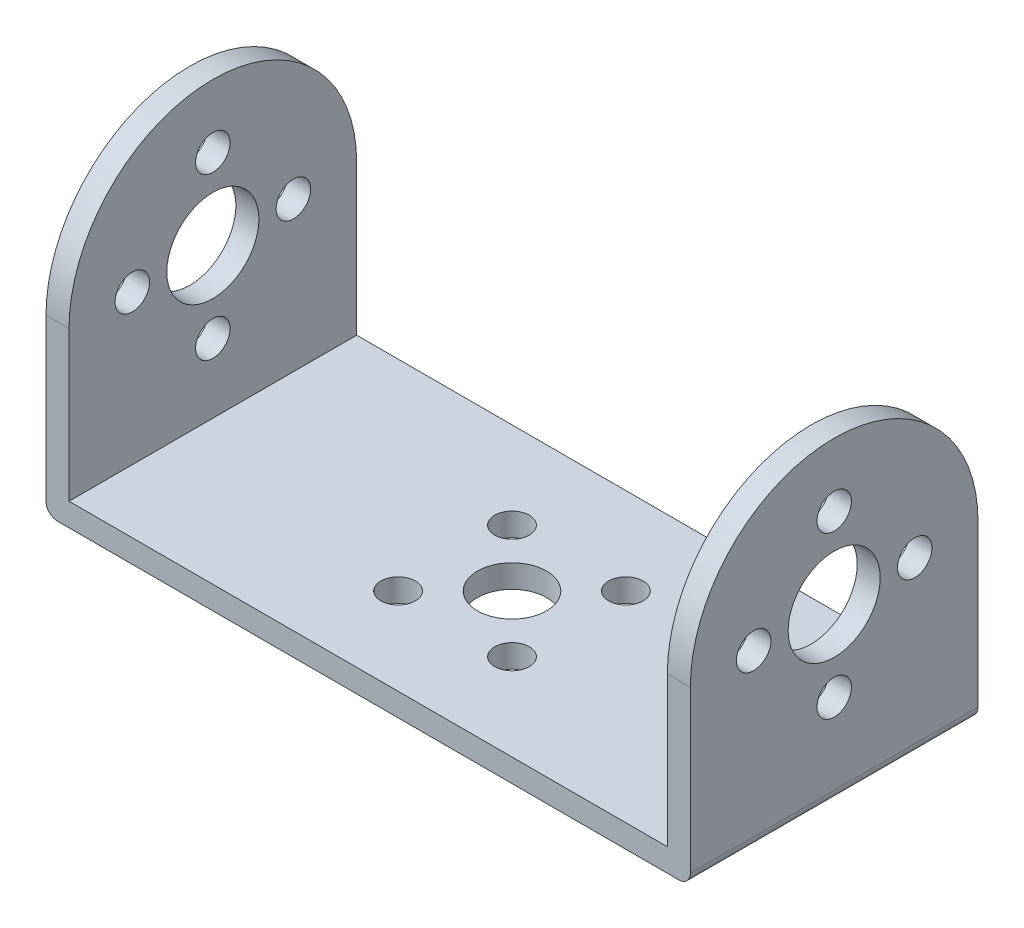
ISO-10303-21;
HEADER;
FILE_DESCRIPTION(('STEP AP214'),'2;1');
FILE_NAME('part.step','',(''),(''),'','','');
FILE_SCHEMA(('AUTOMOTIVE_DESIGN { 1 0 10303 214 1 1 1 1 }'));
ENDSEC;
DATA;
#1=APPLICATION_CONTEXT('core data for automotive mechanical design processes');
#2=APPLICATION_PROTOCOL_DEFINITION('international standard','automotive_design',2000,#1);
#3=PRODUCT_CONTEXT('',#1,'mechanical');
#4=PRODUCT('Part','Part','',(#3));
#5=PRODUCT_RELATED_PRODUCT_CATEGORY('part','',(#4));
#6=PRODUCT_DEFINITION_FORMATION('','',#4);
#7=PRODUCT_DEFINITION_CONTEXT('part definition',#1,'design');
#8=PRODUCT_DEFINITION('design','',#6,#7);
#9=PRODUCT_DEFINITION_SHAPE('','',#8);
#10=(LENGTH_UNIT() NAMED_UNIT(*) SI_UNIT(.MILLI.,.METRE.));
#11=(NAMED_UNIT(*) PLANE_ANGLE_UNIT() SI_UNIT($,.RADIAN.));
#12=(NAMED_UNIT(*) SI_UNIT($,.STERADIAN.) SOLID_ANGLE_UNIT());
#13=UNCERTAINTY_MEASURE_WITH_UNIT(LENGTH_MEASURE(1.E-05),#10,'distance_accuracy_value','');
#14=(GEOMETRIC_REPRESENTATION_CONTEXT(3) GLOBAL_UNCERTAINTY_ASSIGNED_CONTEXT((#13)) GLOBAL_UNIT_ASSIGNED_CONTEXT((#10,
#11,#12)) REPRESENTATION_CONTEXT('',''));
#15=CARTESIAN_POINT('',(0.,0.,0.));
#16=DIRECTION('',(0.,0.,1.));
#17=DIRECTION('',(1.,0.,0.));
#18=AXIS2_PLACEMENT_3D('',#15,#16,#17);
#19=CARTESIAN_POINT('',(0.,2.,0.));
#20=DIRECTION('',(0.,1.,0.));
#21=DIRECTION('',(0.,0.,1.));
#22=AXIS2_PLACEMENT_3D('',#19,#20,#21);
#23=PLANE('',#22);
#24=CARTESIAN_POINT('',(12.6040027874548,2.,-5.68113044702918));
#25=DIRECTION('',(0.,1.,0.));
#26=DIRECTION('',(0.,0.,1.));
#27=AXIS2_PLACEMENT_3D('',#24,#25,#26);
#28=CIRCLE('',#27,1.5);
#29=CARTESIAN_POINT('',(12.6040027874548,2.,-4.18113044702918));
#30=VERTEX_POINT('',#29);
#31=EDGE_CURVE('E240',#30,#30,#28,.T.);
#32=ORIENTED_EDGE('',*,*,#31,.F.);
#33=EDGE_LOOP('',(#32));
#34=FACE_BOUND('',#33,.T.);
#35=CARTESIAN_POINT('',(2.70450785084305,2.,-5.68113044702918));
#36=DIRECTION('',(0.,1.,0.));
#37=DIRECTION('',(0.,0.,1.));
#38=AXIS2_PLACEMENT_3D('',#35,#36,#37);
#39=CIRCLE('',#38,1.5);
#40=CARTESIAN_POINT('',(2.70450785084305,2.,-4.18113044702918));
#41=VERTEX_POINT('',#40);
#42=EDGE_CURVE('E248',#41,#41,#39,.T.);
#43=ORIENTED_EDGE('',*,*,#42,.F.);
#44=EDGE_LOOP('',(#43));
#45=FACE_BOUND('',#44,.T.);
#46=CARTESIAN_POINT('',(12.6040027874548,2.,4.21836448958237));
#47=DIRECTION('',(0.,1.,0.));
#48=DIRECTION('',(0.,0.,1.));
#49=AXIS2_PLACEMENT_3D('',#46,#47,#48);
#50=CIRCLE('',#49,1.5);
#51=CARTESIAN_POINT('',(12.6040027874548,2.,5.71836448958237));
#52=VERTEX_POINT('',#51);
#53=EDGE_CURVE('E256',#52,#52,#50,.T.);
#54=ORIENTED_EDGE('',*,*,#53,.F.);
#55=EDGE_LOOP('',(#54));
#56=FACE_BOUND('',#55,.T.);
#57=CARTESIAN_POINT('',(2.70450785084305,2.,4.21836448958237));
#58=DIRECTION('',(0.,1.,0.));
#59=DIRECTION('',(0.,0.,1.));
#60=AXIS2_PLACEMENT_3D('',#57,#58,#59);
#61=CIRCLE('',#60,1.5);
#62=CARTESIAN_POINT('',(2.70450785084305,2.,5.71836448958237));
#63=VERTEX_POINT('',#62);
#64=EDGE_CURVE('E231',#63,#63,#61,.T.);
#65=ORIENTED_EDGE('',*,*,#64,.F.);
#66=EDGE_LOOP('',(#65));
#67=FACE_BOUND('',#66,.T.);
#68=CARTESIAN_POINT('',(7.65425531914894,2.,-0.731382978723405));
#69=DIRECTION('',(0.,1.,0.));
#70=DIRECTION('',(0.,0.,1.));
#71=AXIS2_PLACEMENT_3D('',#68,#69,#70);
#72=CIRCLE('',#71,3.);
#73=CARTESIAN_POINT('',(7.65425531914894,2.,2.2686170212766));
#74=VERTEX_POINT('',#73);
#75=EDGE_CURVE('E239',#74,#74,#72,.T.);
#76=ORIENTED_EDGE('',*,*,#75,.F.);
#77=EDGE_LOOP('',(#76));
#78=FACE_BOUND('',#77,.T.);
#79=DIRECTION('',(1.,0.,0.));
#80=VECTOR('',#79,1.);
#81=CARTESIAN_POINT('',(-20.3457446808511,2.,11.7686170212766));
#82=LINE('',#81,#80);
#83=CARTESIAN_POINT('',(-18.3457446808511,2.,11.7686170212766));
#84=VERTEX_POINT('',#83);
#85=CARTESIAN_POINT('',(33.6542553191489,2.,11.7686170212766));
#86=VERTEX_POINT('',#85);
#87=EDGE_CURVE('E275',#84,#86,#82,.T.);
#88=ORIENTED_EDGE('',*,*,#87,.T.);
#89=DIRECTION('',(0.,0.,1.));
#90=VECTOR('',#89,1.);
#91=CARTESIAN_POINT('',(33.6542553191489,2.,-13.2313829787234));
#92=LINE('',#91,#90);
#93=CARTESIAN_POINT('',(33.6542553191489,2.,-13.2313829787234));
#94=VERTEX_POINT('',#93);
#95=EDGE_CURVE('E131',#94,#86,#92,.T.);
#96=ORIENTED_EDGE('',*,*,#95,.F.);
#97=DIRECTION('',(-1.,0.,0.));
#98=VECTOR('',#97,1.);
#99=CARTESIAN_POINT('',(-20.3457446808511,2.,-13.2313829787234));
#100=LINE('',#99,#98);
#101=CARTESIAN_POINT('',(-18.3457446808511,2.,-13.2313829787234));
#102=VERTEX_POINT('',#101);
#103=EDGE_CURVE('E278',#94,#102,#100,.T.);
#104=ORIENTED_EDGE('',*,*,#103,.T.);
#105=DIRECTION('',(0.,0.,1.));
#106=VECTOR('',#105,1.);
#107=CARTESIAN_POINT('',(-18.3457446808511,2.,-13.2313829787234));
#108=LINE('',#107,#106);
#109=EDGE_CURVE('E215',#102,#84,#108,.T.);
#110=ORIENTED_EDGE('',*,*,#109,.T.);
#111=EDGE_LOOP('',(#88,#96,#104,#110));
#112=FACE_BOUND('',#111,.T.);
#113=ADVANCED_FACE('F42',(#34,#45,#56,#67,#78,#112),#23,.T.);
#114=CARTESIAN_POINT('',(-20.3457446808511,2.,-13.2313829787234));
#115=DIRECTION('',(1.,0.,0.));
#116=DIRECTION('',(0.,0.,-1.));
#117=AXIS2_PLACEMENT_3D('',#114,#115,#116);
#118=PLANE('',#117);
#119=CARTESIAN_POINT('',(-20.3457446808511,15.,-7.73138297872341));
#120=DIRECTION('',(-1.,0.,0.));
#121=DIRECTION('',(0.,0.,1.));
#122=AXIS2_PLACEMENT_3D('',#119,#120,#121);
#123=CIRCLE('',#122,1.5);
#124=CARTESIAN_POINT('',(-20.3457446808511,15.,-6.23138297872341));
#125=VERTEX_POINT('',#124);
#126=EDGE_CURVE('E165',#125,#125,#123,.T.);
#127=ORIENTED_EDGE('',*,*,#126,.F.);
#128=EDGE_LOOP('',(#127));
#129=FACE_BOUND('',#128,.T.);
#130=CARTESIAN_POINT('',(-20.3457446808511,8.,-0.731382978723406));
#131=DIRECTION('',(-1.,0.,0.));
#132=DIRECTION('',(0.,0.,1.));
#133=AXIS2_PLACEMENT_3D('',#130,#131,#132);
#134=CIRCLE('',#133,1.5);
#135=CARTESIAN_POINT('',(-20.3457446808511,8.,0.768617021276592));
#136=VERTEX_POINT('',#135);
#137=EDGE_CURVE('E167',#136,#136,#134,.T.);
#138=ORIENTED_EDGE('',*,*,#137,.F.);
#139=EDGE_LOOP('',(#138));
#140=FACE_BOUND('',#139,.T.);
#141=CARTESIAN_POINT('',(-20.3457446808511,15.,6.2686170212766));
#142=DIRECTION('',(-1.,0.,0.));
#143=DIRECTION('',(0.,0.,1.));
#144=AXIS2_PLACEMENT_3D('',#141,#142,#143);
#145=CIRCLE('',#144,1.5);
#146=CARTESIAN_POINT('',(-20.3457446808511,15.,7.7686170212766));
#147=VERTEX_POINT('',#146);
#148=EDGE_CURVE('E176',#147,#147,#145,.T.);
#149=ORIENTED_EDGE('',*,*,#148,.F.);
#150=EDGE_LOOP('',(#149));
#151=FACE_BOUND('',#150,.T.);
#152=CARTESIAN_POINT('',(-20.3457446808511,22.,-0.731382978723407));
#153=DIRECTION('',(-1.,0.,0.));
#154=DIRECTION('',(0.,0.,1.));
#155=AXIS2_PLACEMENT_3D('',#152,#153,#154);
#156=CIRCLE('',#155,1.5);
#157=CARTESIAN_POINT('',(-20.3457446808511,22.,0.768617021276595));
#158=VERTEX_POINT('',#157);
#159=EDGE_CURVE('E183',#158,#158,#156,.T.);
#160=ORIENTED_EDGE('',*,*,#159,.F.);
#161=EDGE_LOOP('',(#160));
#162=FACE_BOUND('',#161,.T.);
#163=CARTESIAN_POINT('',(-20.3457446808511,15.,-0.731382978723407));
#164=DIRECTION('',(-1.,0.,0.));
#165=DIRECTION('',(0.,0.,1.));
#166=AXIS2_PLACEMENT_3D('',#163,#164,#165);
#167=CIRCLE('',#166,4.);
#168=CARTESIAN_POINT('',(-20.3457446808511,15.,3.2686170212766));
#169=VERTEX_POINT('',#168);
#170=EDGE_CURVE('E192',#169,#169,#167,.T.);
#171=ORIENTED_EDGE('',*,*,#170,.F.);
#172=EDGE_LOOP('',(#171));
#173=FACE_BOUND('',#172,.T.);
#174=DIRECTION('',(0.,-1.,0.));
#175=VECTOR('',#174,1.);
#176=CARTESIAN_POINT('',(-20.3457446808511,2.,-13.2313829787234));
#177=LINE('',#176,#175);
#178=CARTESIAN_POINT('',(-20.3457446808511,15.,-13.2313829787234));
#179=VERTEX_POINT('',#178);
#180=CARTESIAN_POINT('',(-20.3457446808511,1.,-13.2313829787234));
#181=VERTEX_POINT('',#180);
#182=EDGE_CURVE('E282',#179,#181,#177,.T.);
#183=ORIENTED_EDGE('',*,*,#182,.T.);
#184=DIRECTION('',(0.,0.,1.));
#185=VECTOR('',#184,1.);
#186=CARTESIAN_POINT('',(-20.3457446808511,1.,-13.2313829787234));
#187=LINE('',#186,#185);
#188=CARTESIAN_POINT('',(-20.3457446808511,1.,11.7686170212766));
#189=VERTEX_POINT('',#188);
#190=EDGE_CURVE('E11',#181,#189,#187,.T.);
#191=ORIENTED_EDGE('',*,*,#190,.T.);
#192=DIRECTION('',(0.,-1.,0.));
#193=VECTOR('',#192,1.);
#194=CARTESIAN_POINT('',(-20.3457446808511,2.,11.7686170212766));
#195=LINE('',#194,#193);
#196=CARTESIAN_POINT('',(-20.3457446808511,15.,11.7686170212766));
#197=VERTEX_POINT('',#196);
#198=EDGE_CURVE('E297',#197,#189,#195,.T.);
#199=ORIENTED_EDGE('',*,*,#198,.F.);
#200=CARTESIAN_POINT('',(-20.3457446808511,15.,-0.731382978723407));
#201=DIRECTION('',(-1.,0.,0.));
#202=DIRECTION('',(0.,0.,1.));
#203=AXIS2_PLACEMENT_3D('',#200,#201,#202);
#204=CIRCLE('',#203,12.5);
#205=EDGE_CURVE('E206',#197,#179,#204,.T.);
#206=ORIENTED_EDGE('',*,*,#205,.T.);
#207=EDGE_LOOP('',(#183,#191,#199,#206));
#208=FACE_BOUND('',#207,.T.);
#209=ADVANCED_FACE('F329',(#129,#140,#151,#162,#173,#208),#118,.F.);
#210=CARTESIAN_POINT('',(-20.3457446808511,2.,11.7686170212766));
#211=DIRECTION('',(0.,0.,-1.));
#212=DIRECTION('',(-1.,0.,0.));
#213=AXIS2_PLACEMENT_3D('',#210,#211,#212);
#214=PLANE('',#213);
#215=DIRECTION('',(1.,0.,0.));
#216=VECTOR('',#215,1.);
#217=CARTESIAN_POINT('',(-20.3457446808511,0.,11.7686170212766));
#218=LINE('',#217,#216);
#219=CARTESIAN_POINT('',(-19.3457446808511,0.,11.7686170212766));
#220=VERTEX_POINT('',#219);
#221=CARTESIAN_POINT('',(34.6542553191489,0.,11.7686170212766));
#222=VERTEX_POINT('',#221);
#223=EDGE_CURVE('E271',#220,#222,#218,.T.);
#224=ORIENTED_EDGE('',*,*,#223,.T.);
#225=CARTESIAN_POINT('',(34.6542553191489,1.,11.7686170212766));
#226=DIRECTION('',(0.,0.,-1.));
#227=DIRECTION('',(-1.,0.,0.));
#228=AXIS2_PLACEMENT_3D('',#225,#226,#227);
#229=CIRCLE('',#228,1.);
#230=CARTESIAN_POINT('',(35.6542553191489,1.,11.7686170212766));
#231=VERTEX_POINT('',#230);
#232=EDGE_CURVE('E51',#222,#231,#229,.F.);
#233=ORIENTED_EDGE('',*,*,#232,.T.);
#234=DIRECTION('',(0.,-1.,0.));
#235=VECTOR('',#234,1.);
#236=CARTESIAN_POINT('',(35.6542553191489,2.,11.7686170212766));
#237=LINE('',#236,#235);
#238=CARTESIAN_POINT('',(35.6542553191489,15.,11.7686170212766));
#239=VERTEX_POINT('',#238);
#240=EDGE_CURVE('E140',#239,#231,#237,.T.);
#241=ORIENTED_EDGE('',*,*,#240,.F.);
#242=DIRECTION('',(1.,0.,0.));
#243=VECTOR('',#242,1.);
#244=CARTESIAN_POINT('',(33.6542553191489,15.,11.7686170212766));
#245=LINE('',#244,#243);
#246=CARTESIAN_POINT('',(33.6542553191489,15.,11.7686170212766));
#247=VERTEX_POINT('',#246);
#248=EDGE_CURVE('E137',#247,#239,#245,.T.);
#249=ORIENTED_EDGE('',*,*,#248,.F.);
#250=DIRECTION('',(0.,1.,0.));
#251=VECTOR('',#250,1.);
#252=CARTESIAN_POINT('',(33.6542553191489,15.,11.7686170212766));
#253=LINE('',#252,#251);
#254=EDGE_CURVE('E123',#86,#247,#253,.T.);
#255=ORIENTED_EDGE('',*,*,#254,.F.);
#256=ORIENTED_EDGE('',*,*,#87,.F.);
#257=DIRECTION('',(0.,1.,0.));
#258=VECTOR('',#257,1.);
#259=CARTESIAN_POINT('',(-18.3457446808511,15.,11.7686170212766));
#260=LINE('',#259,#258);
#261=CARTESIAN_POINT('',(-18.3457446808511,15.,11.7686170212766));
#262=VERTEX_POINT('',#261);
#263=EDGE_CURVE('E219',#84,#262,#260,.T.);
#264=ORIENTED_EDGE('',*,*,#263,.T.);
#265=DIRECTION('',(-1.,0.,0.));
#266=VECTOR('',#265,1.);
#267=CARTESIAN_POINT('',(-18.3457446808511,15.,11.7686170212766));
#268=LINE('',#267,#266);
#269=EDGE_CURVE('E227',#262,#197,#268,.T.);
#270=ORIENTED_EDGE('',*,*,#269,.T.);
#271=ORIENTED_EDGE('',*,*,#198,.T.);
#272=CARTESIAN_POINT('',(-19.3457446808511,1.,11.7686170212766));
#273=DIRECTION('',(0.,0.,-1.));
#274=DIRECTION('',(-1.,0.,0.));
#275=AXIS2_PLACEMENT_3D('',#272,#273,#274);
#276=CIRCLE('',#275,1.);
#277=EDGE_CURVE('E58',#189,#220,#276,.F.);
#278=ORIENTED_EDGE('',*,*,#277,.T.);
#279=EDGE_LOOP('',(#224,#233,#241,#249,#255,#256,#264,#270,#271,#278));
#280=FACE_BOUND('',#279,.T.);
#281=ADVANCED_FACE('F138',(#280),#214,.F.);
#282=CARTESIAN_POINT('',(35.6542553191489,2.,-13.2313829787234));
#283=DIRECTION('',(-1.,0.,0.));
#284=DIRECTION('',(0.,0.,1.));
#285=AXIS2_PLACEMENT_3D('',#282,#283,#284);
#286=PLANE('',#285);
#287=CARTESIAN_POINT('',(35.6542553191489,15.,-7.73138297872341));
#288=DIRECTION('',(-1.,0.,0.));
#289=DIRECTION('',(0.,0.,1.));
#290=AXIS2_PLACEMENT_3D('',#287,#288,#289);
#291=CIRCLE('',#290,1.5);
#292=CARTESIAN_POINT('',(35.6542553191489,15.,-6.23138297872341));
#293=VERTEX_POINT('',#292);
#294=EDGE_CURVE('E740',#293,#293,#291,.T.);
#295=ORIENTED_EDGE('',*,*,#294,.T.);
#296=EDGE_LOOP('',(#295));
#297=FACE_BOUND('',#296,.T.);
#298=CARTESIAN_POINT('',(35.6542553191489,8.,-0.731382978723406));
#299=DIRECTION('',(-1.,0.,0.));
#300=DIRECTION('',(0.,0.,1.));
#301=AXIS2_PLACEMENT_3D('',#298,#299,#300);
#302=CIRCLE('',#301,1.5);
#303=CARTESIAN_POINT('',(35.6542553191489,8.,0.768617021276592));
#304=VERTEX_POINT('',#303);
#305=EDGE_CURVE('E733',#304,#304,#302,.T.);
#306=ORIENTED_EDGE('',*,*,#305,.T.);
#307=EDGE_LOOP('',(#306));
#308=FACE_BOUND('',#307,.T.);
#309=CARTESIAN_POINT('',(35.6542553191489,15.,6.2686170212766));
#310=DIRECTION('',(-1.,0.,0.));
#311=DIRECTION('',(0.,0.,1.));
#312=AXIS2_PLACEMENT_3D('',#309,#310,#311);
#313=CIRCLE('',#312,1.5);
#314=CARTESIAN_POINT('',(35.6542553191489,15.,7.7686170212766));
#315=VERTEX_POINT('',#314);
#316=EDGE_CURVE('E724',#315,#315,#313,.T.);
#317=ORIENTED_EDGE('',*,*,#316,.T.);
#318=EDGE_LOOP('',(#317));
#319=FACE_BOUND('',#318,.T.);
#320=CARTESIAN_POINT('',(35.6542553191489,22.,-0.731382978723407));
#321=DIRECTION('',(-1.,0.,0.));
#322=DIRECTION('',(0.,0.,1.));
#323=AXIS2_PLACEMENT_3D('',#320,#321,#322);
#324=CIRCLE('',#323,1.5);
#325=CARTESIAN_POINT('',(35.6542553191489,22.,0.768617021276595));
#326=VERTEX_POINT('',#325);
#327=EDGE_CURVE('E715',#326,#326,#324,.T.);
#328=ORIENTED_EDGE('',*,*,#327,.T.);
#329=EDGE_LOOP('',(#328));
#330=FACE_BOUND('',#329,.T.);
#331=CARTESIAN_POINT('',(35.6542553191489,15.,-0.731382978723407));
#332=DIRECTION('',(-1.,0.,0.));
#333=DIRECTION('',(0.,0.,1.));
#334=AXIS2_PLACEMENT_3D('',#331,#332,#333);
#335=CIRCLE('',#334,4.);
#336=CARTESIAN_POINT('',(35.6542553191489,15.,3.2686170212766));
#337=VERTEX_POINT('',#336);
#338=EDGE_CURVE('E154',#337,#337,#335,.T.);
#339=ORIENTED_EDGE('',*,*,#338,.T.);
#340=EDGE_LOOP('',(#339));
#341=FACE_BOUND('',#340,.T.);
#342=ORIENTED_EDGE('',*,*,#240,.T.);
#343=DIRECTION('',(0.,0.,-1.));
#344=VECTOR('',#343,1.);
#345=CARTESIAN_POINT('',(35.6542553191489,1.,-13.2313829787234));
#346=LINE('',#345,#344);
#347=CARTESIAN_POINT('',(35.6542553191489,1.,-13.2313829787234));
#348=VERTEX_POINT('',#347);
#349=EDGE_CURVE('E301',#231,#348,#346,.T.);
#350=ORIENTED_EDGE('',*,*,#349,.T.);
#351=DIRECTION('',(0.,-1.,0.));
#352=VECTOR('',#351,1.);
#353=CARTESIAN_POINT('',(35.6542553191489,2.,-13.2313829787234));
#354=LINE('',#353,#352);
#355=CARTESIAN_POINT('',(35.6542553191489,15.,-13.2313829787234));
#356=VERTEX_POINT('',#355);
#357=EDGE_CURVE('E291',#356,#348,#354,.T.);
#358=ORIENTED_EDGE('',*,*,#357,.F.);
#359=CARTESIAN_POINT('',(35.6542553191489,15.,-0.731382978723407));
#360=DIRECTION('',(-1.,0.,0.));
#361=DIRECTION('',(0.,0.,1.));
#362=AXIS2_PLACEMENT_3D('',#359,#360,#361);
#363=CIRCLE('',#362,12.5);
#364=EDGE_CURVE('E151',#239,#356,#363,.T.);
#365=ORIENTED_EDGE('',*,*,#364,.F.);
#366=EDGE_LOOP('',(#342,#350,#358,#365));
#367=FACE_BOUND('',#366,.T.);
#368=ADVANCED_FACE('F322',(#297,#308,#319,#330,#341,#367),#286,.F.);
#369=CARTESIAN_POINT('',(-20.3457446808511,2.,-13.2313829787234));
#370=DIRECTION('',(0.,0.,1.));
#371=DIRECTION('',(1.,0.,0.));
#372=AXIS2_PLACEMENT_3D('',#369,#370,#371);
#373=PLANE('',#372);
#374=ORIENTED_EDGE('',*,*,#357,.T.);
#375=CARTESIAN_POINT('',(34.6542553191489,1.,-13.2313829787234));
#376=DIRECTION('',(0.,0.,1.));
#377=DIRECTION('',(1.,0.,0.));
#378=AXIS2_PLACEMENT_3D('',#375,#376,#377);
#379=CIRCLE('',#378,1.);
#380=CARTESIAN_POINT('',(34.6542553191489,0.,-13.2313829787234));
#381=VERTEX_POINT('',#380);
#382=EDGE_CURVE('E308',#348,#381,#379,.F.);
#383=ORIENTED_EDGE('',*,*,#382,.T.);
#384=DIRECTION('',(-1.,0.,0.));
#385=VECTOR('',#384,1.);
#386=CARTESIAN_POINT('',(-20.3457446808511,0.,-13.2313829787234));
#387=LINE('',#386,#385);
#388=CARTESIAN_POINT('',(-19.3457446808511,0.,-13.2313829787234));
#389=VERTEX_POINT('',#388);
#390=EDGE_CURVE('E279',#381,#389,#387,.T.);
#391=ORIENTED_EDGE('',*,*,#390,.T.);
#392=CARTESIAN_POINT('',(-19.3457446808511,1.,-13.2313829787234));
#393=DIRECTION('',(0.,0.,1.));
#394=DIRECTION('',(1.,0.,0.));
#395=AXIS2_PLACEMENT_3D('',#392,#393,#394);
#396=CIRCLE('',#395,1.);
#397=EDGE_CURVE('E305',#389,#181,#396,.F.);
#398=ORIENTED_EDGE('',*,*,#397,.T.);
#399=ORIENTED_EDGE('',*,*,#182,.F.);
#400=DIRECTION('',(-1.,0.,0.));
#401=VECTOR('',#400,1.);
#402=CARTESIAN_POINT('',(-18.3457446808511,15.,-13.2313829787234));
#403=LINE('',#402,#401);
#404=CARTESIAN_POINT('',(-18.3457446808511,15.,-13.2313829787234));
#405=VERTEX_POINT('',#404);
#406=EDGE_CURVE('E223',#405,#179,#403,.T.);
#407=ORIENTED_EDGE('',*,*,#406,.F.);
#408=DIRECTION('',(0.,-1.,0.));
#409=VECTOR('',#408,1.);
#410=CARTESIAN_POINT('',(-18.3457446808511,15.,-13.2313829787234));
#411=LINE('',#410,#409);
#412=EDGE_CURVE('E211',#405,#102,#411,.T.);
#413=ORIENTED_EDGE('',*,*,#412,.T.);
#414=ORIENTED_EDGE('',*,*,#103,.F.);
#415=DIRECTION('',(0.,-1.,0.));
#416=VECTOR('',#415,1.);
#417=CARTESIAN_POINT('',(33.6542553191489,15.,-13.2313829787234));
#418=LINE('',#417,#416);
#419=CARTESIAN_POINT('',(33.6542553191489,15.,-13.2313829787234));
#420=VERTEX_POINT('',#419);
#421=EDGE_CURVE('E146',#420,#94,#418,.T.);
#422=ORIENTED_EDGE('',*,*,#421,.F.);
#423=DIRECTION('',(1.,0.,0.));
#424=VECTOR('',#423,1.);
#425=CARTESIAN_POINT('',(33.6542553191489,15.,-13.2313829787234));
#426=LINE('',#425,#424);
#427=EDGE_CURVE('E145',#420,#356,#426,.T.);
#428=ORIENTED_EDGE('',*,*,#427,.T.);
#429=EDGE_LOOP('',(#374,#383,#391,#398,#399,#407,#413,#414,#422,#428));
#430=FACE_BOUND('',#429,.T.);
#431=ADVANCED_FACE('F325',(#430),#373,.F.);
#432=CARTESIAN_POINT('',(0.,0.,0.));
#433=DIRECTION('',(0.,1.,0.));
#434=DIRECTION('',(0.,0.,1.));
#435=AXIS2_PLACEMENT_3D('',#432,#433,#434);
#436=PLANE('',#435);
#437=CARTESIAN_POINT('',(12.6040027874548,0.,-5.68113044702918));
#438=DIRECTION('',(0.,1.,0.));
#439=DIRECTION('',(0.,0.,1.));
#440=AXIS2_PLACEMENT_3D('',#437,#438,#439);
#441=CIRCLE('',#440,1.5);
#442=CARTESIAN_POINT('',(12.6040027874548,0.,-4.18113044702918));
#443=VERTEX_POINT('',#442);
#444=EDGE_CURVE('E235',#443,#443,#441,.T.);
#445=ORIENTED_EDGE('',*,*,#444,.T.);
#446=EDGE_LOOP('',(#445));
#447=FACE_BOUND('',#446,.T.);
#448=CARTESIAN_POINT('',(2.70450785084305,0.,-5.68113044702918));
#449=DIRECTION('',(0.,1.,0.));
#450=DIRECTION('',(0.,0.,1.));
#451=AXIS2_PLACEMENT_3D('',#448,#449,#450);
#452=CIRCLE('',#451,1.5);
#453=CARTESIAN_POINT('',(2.70450785084305,0.,-4.18113044702918));
#454=VERTEX_POINT('',#453);
#455=EDGE_CURVE('E244',#454,#454,#452,.T.);
#456=ORIENTED_EDGE('',*,*,#455,.T.);
#457=EDGE_LOOP('',(#456));
#458=FACE_BOUND('',#457,.T.);
#459=CARTESIAN_POINT('',(12.6040027874548,0.,4.21836448958237));
#460=DIRECTION('',(0.,1.,0.));
#461=DIRECTION('',(0.,0.,1.));
#462=AXIS2_PLACEMENT_3D('',#459,#460,#461);
#463=CIRCLE('',#462,1.5);
#464=CARTESIAN_POINT('',(12.6040027874548,0.,5.71836448958237));
#465=VERTEX_POINT('',#464);
#466=EDGE_CURVE('E252',#465,#465,#463,.T.);
#467=ORIENTED_EDGE('',*,*,#466,.T.);
#468=EDGE_LOOP('',(#467));
#469=FACE_BOUND('',#468,.T.);
#470=CARTESIAN_POINT('',(2.70450785084305,0.,4.21836448958237));
#471=DIRECTION('',(0.,1.,0.));
#472=DIRECTION('',(0.,0.,1.));
#473=AXIS2_PLACEMENT_3D('',#470,#471,#472);
#474=CIRCLE('',#473,1.5);
#475=CARTESIAN_POINT('',(2.70450785084305,0.,5.71836448958237));
#476=VERTEX_POINT('',#475);
#477=EDGE_CURVE('E260',#476,#476,#474,.T.);
#478=ORIENTED_EDGE('',*,*,#477,.T.);
#479=EDGE_LOOP('',(#478));
#480=FACE_BOUND('',#479,.T.);
#481=CARTESIAN_POINT('',(7.65425531914894,0.,-0.731382978723405));
#482=DIRECTION('',(0.,1.,0.));
#483=DIRECTION('',(0.,0.,1.));
#484=AXIS2_PLACEMENT_3D('',#481,#482,#483);
#485=CIRCLE('',#484,3.);
#486=CARTESIAN_POINT('',(7.65425531914894,0.,2.2686170212766));
#487=VERTEX_POINT('',#486);
#488=EDGE_CURVE('E267',#487,#487,#485,.T.);
#489=ORIENTED_EDGE('',*,*,#488,.T.);
#490=EDGE_LOOP('',(#489));
#491=FACE_BOUND('',#490,.T.);
#492=ORIENTED_EDGE('',*,*,#390,.F.);
#493=DIRECTION('',(0.,0.,-1.));
#494=VECTOR('',#493,1.);
#495=CARTESIAN_POINT('',(34.6542553191489,0.,0.));
#496=LINE('',#495,#494);
#497=EDGE_CURVE('E65',#381,#222,#496,.F.);
#498=ORIENTED_EDGE('',*,*,#497,.T.);
#499=ORIENTED_EDGE('',*,*,#223,.F.);
#500=DIRECTION('',(0.,0.,1.));
#501=VECTOR('',#500,1.);
#502=CARTESIAN_POINT('',(-19.3457446808511,0.,0.));
#503=LINE('',#502,#501);
#504=EDGE_CURVE('E311',#220,#389,#503,.F.);
#505=ORIENTED_EDGE('',*,*,#504,.T.);
#506=EDGE_LOOP('',(#492,#498,#499,#505));
#507=FACE_BOUND('',#506,.T.);
#508=ADVANCED_FACE('F327',(#447,#458,#469,#480,#491,#507),#436,.F.);
#509=CARTESIAN_POINT('',(7.65425531914894,0.,-0.731382978723405));
#510=DIRECTION('',(0.,1.,0.));
#511=DIRECTION('',(0.,0.,1.));
#512=AXIS2_PLACEMENT_3D('',#509,#510,#511);
#513=CYLINDRICAL_SURFACE('',#512,3.);
#514=ORIENTED_EDGE('',*,*,#488,.F.);
#515=EDGE_LOOP('',(#514));
#516=FACE_BOUND('',#515,.T.);
#517=ORIENTED_EDGE('',*,*,#75,.T.);
#518=EDGE_LOOP('',(#517));
#519=FACE_BOUND('',#518,.T.);
#520=ADVANCED_FACE('F351',(#516,#519),#513,.F.);
#521=CARTESIAN_POINT('',(2.70450785084305,0.,4.21836448958237));
#522=DIRECTION('',(0.,1.,0.));
#523=DIRECTION('',(0.,0.,1.));
#524=AXIS2_PLACEMENT_3D('',#521,#522,#523);
#525=CYLINDRICAL_SURFACE('',#524,1.5);
#526=ORIENTED_EDGE('',*,*,#477,.F.);
#527=EDGE_LOOP('',(#526));
#528=FACE_BOUND('',#527,.T.);
#529=ORIENTED_EDGE('',*,*,#64,.T.);
#530=EDGE_LOOP('',(#529));
#531=FACE_BOUND('',#530,.T.);
#532=ADVANCED_FACE('F431',(#528,#531),#525,.F.);
#533=CARTESIAN_POINT('',(12.6040027874548,0.,4.21836448958237));
#534=DIRECTION('',(0.,1.,0.));
#535=DIRECTION('',(0.,0.,1.));
#536=AXIS2_PLACEMENT_3D('',#533,#534,#535);
#537=CYLINDRICAL_SURFACE('',#536,1.5);
#538=ORIENTED_EDGE('',*,*,#466,.F.);
#539=EDGE_LOOP('',(#538));
#540=FACE_BOUND('',#539,.T.);
#541=ORIENTED_EDGE('',*,*,#53,.T.);
#542=EDGE_LOOP('',(#541));
#543=FACE_BOUND('',#542,.T.);
#544=ADVANCED_FACE('F428',(#540,#543),#537,.F.);
#545=CARTESIAN_POINT('',(2.70450785084305,0.,-5.68113044702918));
#546=DIRECTION('',(0.,1.,0.));
#547=DIRECTION('',(0.,0.,1.));
#548=AXIS2_PLACEMENT_3D('',#545,#546,#547);
#549=CYLINDRICAL_SURFACE('',#548,1.5);
#550=ORIENTED_EDGE('',*,*,#455,.F.);
#551=EDGE_LOOP('',(#550));
#552=FACE_BOUND('',#551,.T.);
#553=ORIENTED_EDGE('',*,*,#42,.T.);
#554=EDGE_LOOP('',(#553));
#555=FACE_BOUND('',#554,.T.);
#556=ADVANCED_FACE('F424',(#552,#555),#549,.F.);
#557=CARTESIAN_POINT('',(12.6040027874548,0.,-5.68113044702918));
#558=DIRECTION('',(0.,1.,0.));
#559=DIRECTION('',(0.,0.,1.));
#560=AXIS2_PLACEMENT_3D('',#557,#558,#559);
#561=CYLINDRICAL_SURFACE('',#560,1.5);
#562=ORIENTED_EDGE('',*,*,#444,.F.);
#563=EDGE_LOOP('',(#562));
#564=FACE_BOUND('',#563,.T.);
#565=ORIENTED_EDGE('',*,*,#31,.T.);
#566=EDGE_LOOP('',(#565));
#567=FACE_BOUND('',#566,.T.);
#568=ADVANCED_FACE('F421',(#564,#567),#561,.F.);
#569=CARTESIAN_POINT('',(-18.3457446808511,15.,-0.731382978723407));
#570=DIRECTION('',(-1.,0.,0.));
#571=DIRECTION('',(0.,0.,1.));
#572=AXIS2_PLACEMENT_3D('',#569,#570,#571);
#573=CYLINDRICAL_SURFACE('',#572,12.5);
#574=ORIENTED_EDGE('',*,*,#205,.F.);
#575=ORIENTED_EDGE('',*,*,#269,.F.);
#576=CARTESIAN_POINT('',(-18.3457446808511,15.,-0.731382978723407));
#577=DIRECTION('',(-1.,0.,0.));
#578=DIRECTION('',(0.,0.,1.));
#579=AXIS2_PLACEMENT_3D('',#576,#577,#578);
#580=CIRCLE('',#579,12.5);
#581=EDGE_CURVE('E207',#262,#405,#580,.T.);
#582=ORIENTED_EDGE('',*,*,#581,.T.);
#583=ORIENTED_EDGE('',*,*,#406,.T.);
#584=EDGE_LOOP('',(#574,#575,#582,#583));
#585=FACE_BOUND('',#584,.T.);
#586=ADVANCED_FACE('F332',(#585),#573,.T.);
#587=CARTESIAN_POINT('',(-18.3457446808511,15.,-0.731382978723407));
#588=DIRECTION('',(-1.,0.,0.));
#589=DIRECTION('',(0.,0.,1.));
#590=AXIS2_PLACEMENT_3D('',#587,#588,#589);
#591=PLANE('',#590);
#592=CARTESIAN_POINT('',(-18.3457446808511,15.,-7.73138297872341));
#593=DIRECTION('',(-1.,0.,0.));
#594=DIRECTION('',(0.,0.,1.));
#595=AXIS2_PLACEMENT_3D('',#592,#593,#594);
#596=CIRCLE('',#595,1.5);
#597=CARTESIAN_POINT('',(-18.3457446808511,15.,-6.23138297872341));
#598=VERTEX_POINT('',#597);
#599=EDGE_CURVE('E172',#598,#598,#596,.F.);
#600=ORIENTED_EDGE('',*,*,#599,.F.);
#601=EDGE_LOOP('',(#600));
#602=FACE_BOUND('',#601,.T.);
#603=CARTESIAN_POINT('',(-18.3457446808511,8.,-0.731382978723406));
#604=DIRECTION('',(-1.,0.,0.));
#605=DIRECTION('',(0.,0.,1.));
#606=AXIS2_PLACEMENT_3D('',#603,#604,#605);
#607=CIRCLE('',#606,1.5);
#608=CARTESIAN_POINT('',(-18.3457446808511,8.,0.768617021276592));
#609=VERTEX_POINT('',#608);
#610=EDGE_CURVE('E171',#609,#609,#607,.F.);
#611=ORIENTED_EDGE('',*,*,#610,.F.);
#612=EDGE_LOOP('',(#611));
#613=FACE_BOUND('',#612,.T.);
#614=CARTESIAN_POINT('',(-18.3457446808511,15.,6.2686170212766));
#615=DIRECTION('',(-1.,0.,0.));
#616=DIRECTION('',(0.,0.,1.));
#617=AXIS2_PLACEMENT_3D('',#614,#615,#616);
#618=CIRCLE('',#617,1.5);
#619=CARTESIAN_POINT('',(-18.3457446808511,15.,7.7686170212766));
#620=VERTEX_POINT('',#619);
#621=EDGE_CURVE('E188',#620,#620,#618,.F.);
#622=ORIENTED_EDGE('',*,*,#621,.F.);
#623=EDGE_LOOP('',(#622));
#624=FACE_BOUND('',#623,.T.);
#625=CARTESIAN_POINT('',(-18.3457446808511,22.,-0.731382978723407));
#626=DIRECTION('',(-1.,0.,0.));
#627=DIRECTION('',(0.,0.,1.));
#628=AXIS2_PLACEMENT_3D('',#625,#626,#627);
#629=CIRCLE('',#628,1.5);
#630=CARTESIAN_POINT('',(-18.3457446808511,22.,0.768617021276595));
#631=VERTEX_POINT('',#630);
#632=EDGE_CURVE('E187',#631,#631,#629,.F.);
#633=ORIENTED_EDGE('',*,*,#632,.F.);
#634=EDGE_LOOP('',(#633));
#635=FACE_BOUND('',#634,.T.);
#636=CARTESIAN_POINT('',(-18.3457446808511,15.,-0.731382978723407));
#637=DIRECTION('',(-1.,0.,0.));
#638=DIRECTION('',(0.,0.,1.));
#639=AXIS2_PLACEMENT_3D('',#636,#637,#638);
#640=CIRCLE('',#639,4.);
#641=CARTESIAN_POINT('',(-18.3457446808511,15.,3.2686170212766));
#642=VERTEX_POINT('',#641);
#643=EDGE_CURVE('E202',#642,#642,#640,.F.);
#644=ORIENTED_EDGE('',*,*,#643,.F.);
#645=EDGE_LOOP('',(#644));
#646=FACE_BOUND('',#645,.T.);
#647=ORIENTED_EDGE('',*,*,#581,.F.);
#648=ORIENTED_EDGE('',*,*,#263,.F.);
#649=ORIENTED_EDGE('',*,*,#109,.F.);
#650=ORIENTED_EDGE('',*,*,#412,.F.);
#651=EDGE_LOOP('',(#647,#648,#649,#650));
#652=FACE_BOUND('',#651,.T.);
#653=ADVANCED_FACE('F337',(#602,#613,#624,#635,#646,#652),#591,.F.);
#654=CARTESIAN_POINT('',(35.6552553191489,15.,-0.731382978723407));
#655=DIRECTION('',(-1.,0.,0.));
#656=DIRECTION('',(0.,0.,1.));
#657=AXIS2_PLACEMENT_3D('',#654,#655,#656);
#658=CYLINDRICAL_SURFACE('',#657,4.);
#659=ORIENTED_EDGE('',*,*,#170,.T.);
#660=EDGE_LOOP('',(#659));
#661=FACE_BOUND('',#660,.T.);
#662=ORIENTED_EDGE('',*,*,#643,.T.);
#663=EDGE_LOOP('',(#662));
#664=FACE_BOUND('',#663,.T.);
#665=ADVANCED_FACE('F408',(#661,#664),#658,.F.);
#666=CARTESIAN_POINT('',(35.6552553191489,22.,-0.731382978723407));
#667=DIRECTION('',(-1.,0.,0.));
#668=DIRECTION('',(0.,0.,1.));
#669=AXIS2_PLACEMENT_3D('',#666,#667,#668);
#670=CYLINDRICAL_SURFACE('',#669,1.5);
#671=ORIENTED_EDGE('',*,*,#159,.T.);
#672=EDGE_LOOP('',(#671));
#673=FACE_BOUND('',#672,.T.);
#674=ORIENTED_EDGE('',*,*,#632,.T.);
#675=EDGE_LOOP('',(#674));
#676=FACE_BOUND('',#675,.T.);
#677=ADVANCED_FACE('F405',(#673,#676),#670,.F.);
#678=CARTESIAN_POINT('',(35.6552553191489,15.,6.2686170212766));
#679=DIRECTION('',(-1.,0.,0.));
#680=DIRECTION('',(0.,0.,1.));
#681=AXIS2_PLACEMENT_3D('',#678,#679,#680);
#682=CYLINDRICAL_SURFACE('',#681,1.5);
#683=ORIENTED_EDGE('',*,*,#148,.T.);
#684=EDGE_LOOP('',(#683));
#685=FACE_BOUND('',#684,.T.);
#686=ORIENTED_EDGE('',*,*,#621,.T.);
#687=EDGE_LOOP('',(#686));
#688=FACE_BOUND('',#687,.T.);
#689=ADVANCED_FACE('F400',(#685,#688),#682,.F.);
#690=CARTESIAN_POINT('',(35.6552553191489,8.,-0.731382978723406));
#691=DIRECTION('',(-1.,0.,0.));
#692=DIRECTION('',(0.,0.,1.));
#693=AXIS2_PLACEMENT_3D('',#690,#691,#692);
#694=CYLINDRICAL_SURFACE('',#693,1.5);
#695=ORIENTED_EDGE('',*,*,#137,.T.);
#696=EDGE_LOOP('',(#695));
#697=FACE_BOUND('',#696,.T.);
#698=ORIENTED_EDGE('',*,*,#610,.T.);
#699=EDGE_LOOP('',(#698));
#700=FACE_BOUND('',#699,.T.);
#701=ADVANCED_FACE('F397',(#697,#700),#694,.F.);
#702=CARTESIAN_POINT('',(35.6552553191489,15.,-7.73138297872341));
#703=DIRECTION('',(-1.,0.,0.));
#704=DIRECTION('',(0.,0.,1.));
#705=AXIS2_PLACEMENT_3D('',#702,#703,#704);
#706=CYLINDRICAL_SURFACE('',#705,1.5);
#707=ORIENTED_EDGE('',*,*,#126,.T.);
#708=EDGE_LOOP('',(#707));
#709=FACE_BOUND('',#708,.T.);
#710=ORIENTED_EDGE('',*,*,#599,.T.);
#711=EDGE_LOOP('',(#710));
#712=FACE_BOUND('',#711,.T.);
#713=ADVANCED_FACE('F396',(#709,#712),#706,.F.);
#714=CARTESIAN_POINT('',(33.6542553191489,15.,-0.731382978723407));
#715=DIRECTION('',(1.,0.,0.));
#716=DIRECTION('',(0.,0.,-1.));
#717=AXIS2_PLACEMENT_3D('',#714,#715,#716);
#718=CYLINDRICAL_SURFACE('',#717,12.5);
#719=ORIENTED_EDGE('',*,*,#364,.T.);
#720=ORIENTED_EDGE('',*,*,#427,.F.);
#721=CARTESIAN_POINT('',(33.6542553191489,15.,-0.731382978723407));
#722=DIRECTION('',(-1.,0.,0.));
#723=DIRECTION('',(0.,0.,1.));
#724=AXIS2_PLACEMENT_3D('',#721,#722,#723);
#725=CIRCLE('',#724,12.5);
#726=EDGE_CURVE('E128',#247,#420,#725,.T.);
#727=ORIENTED_EDGE('',*,*,#726,.F.);
#728=ORIENTED_EDGE('',*,*,#248,.T.);
#729=EDGE_LOOP('',(#719,#720,#727,#728));
#730=FACE_BOUND('',#729,.T.);
#731=ADVANCED_FACE('F148',(#730),#718,.T.);
#732=CARTESIAN_POINT('',(33.6542553191489,15.,-0.731382978723407));
#733=DIRECTION('',(1.,0.,0.));
#734=DIRECTION('',(0.,0.,1.));
#735=AXIS2_PLACEMENT_3D('',#732,#733,#734);
#736=PLANE('',#735);
#737=CARTESIAN_POINT('',(33.6542553191489,15.,-7.73138297872341));
#738=DIRECTION('',(1.,0.,0.));
#739=DIRECTION('',(0.,0.,-1.));
#740=AXIS2_PLACEMENT_3D('',#737,#738,#739);
#741=CIRCLE('',#740,1.5);
#742=CARTESIAN_POINT('',(33.6542553191489,15.,-9.23138297872342));
#743=VERTEX_POINT('',#742);
#744=EDGE_CURVE('E698',#743,#743,#741,.T.);
#745=ORIENTED_EDGE('',*,*,#744,.T.);
#746=EDGE_LOOP('',(#745));
#747=FACE_BOUND('',#746,.T.);
#748=CARTESIAN_POINT('',(33.6542553191489,8.,-0.731382978723406));
#749=DIRECTION('',(1.,0.,0.));
#750=DIRECTION('',(0.,0.,-1.));
#751=AXIS2_PLACEMENT_3D('',#748,#749,#750);
#752=CIRCLE('',#751,1.5);
#753=CARTESIAN_POINT('',(33.6542553191489,8.,-2.2313829787234));
#754=VERTEX_POINT('',#753);
#755=EDGE_CURVE('E702',#754,#754,#752,.T.);
#756=ORIENTED_EDGE('',*,*,#755,.T.);
#757=EDGE_LOOP('',(#756));
#758=FACE_BOUND('',#757,.T.);
#759=CARTESIAN_POINT('',(33.6542553191489,15.,6.2686170212766));
#760=DIRECTION('',(1.,0.,0.));
#761=DIRECTION('',(0.,0.,-1.));
#762=AXIS2_PLACEMENT_3D('',#759,#760,#761);
#763=CIRCLE('',#762,1.5);
#764=CARTESIAN_POINT('',(33.6542553191489,15.,4.7686170212766));
#765=VERTEX_POINT('',#764);
#766=EDGE_CURVE('E706',#765,#765,#763,.T.);
#767=ORIENTED_EDGE('',*,*,#766,.T.);
#768=EDGE_LOOP('',(#767));
#769=FACE_BOUND('',#768,.T.);
#770=CARTESIAN_POINT('',(33.6542553191489,22.,-0.731382978723407));
#771=DIRECTION('',(1.,0.,0.));
#772=DIRECTION('',(0.,0.,-1.));
#773=AXIS2_PLACEMENT_3D('',#770,#771,#772);
#774=CIRCLE('',#773,1.5);
#775=CARTESIAN_POINT('',(33.6542553191489,22.,-2.23138297872341));
#776=VERTEX_POINT('',#775);
#777=EDGE_CURVE('E710',#776,#776,#774,.T.);
#778=ORIENTED_EDGE('',*,*,#777,.T.);
#779=EDGE_LOOP('',(#778));
#780=FACE_BOUND('',#779,.T.);
#781=CARTESIAN_POINT('',(33.6542553191489,15.,-0.731382978723407));
#782=DIRECTION('',(1.,0.,0.));
#783=DIRECTION('',(0.,0.,-1.));
#784=AXIS2_PLACEMENT_3D('',#781,#782,#783);
#785=CIRCLE('',#784,4.);
#786=CARTESIAN_POINT('',(33.6542553191489,15.,-4.73138297872341));
#787=VERTEX_POINT('',#786);
#788=EDGE_CURVE('E157',#787,#787,#785,.T.);
#789=ORIENTED_EDGE('',*,*,#788,.T.);
#790=EDGE_LOOP('',(#789));
#791=FACE_BOUND('',#790,.T.);
#792=ORIENTED_EDGE('',*,*,#726,.T.);
#793=ORIENTED_EDGE('',*,*,#421,.T.);
#794=ORIENTED_EDGE('',*,*,#95,.T.);
#795=ORIENTED_EDGE('',*,*,#254,.T.);
#796=EDGE_LOOP('',(#792,#793,#794,#795));
#797=FACE_BOUND('',#796,.T.);
#798=ADVANCED_FACE('F125',(#747,#758,#769,#780,#791,#797),#736,.F.);
#799=CARTESIAN_POINT('',(-20.3467446808511,15.,-0.731382978723407));
#800=DIRECTION('',(1.,0.,0.));
#801=DIRECTION('',(0.,0.,-1.));
#802=AXIS2_PLACEMENT_3D('',#799,#800,#801);
#803=CYLINDRICAL_SURFACE('',#802,4.);
#804=ORIENTED_EDGE('',*,*,#338,.F.);
#805=EDGE_LOOP('',(#804));
#806=FACE_BOUND('',#805,.T.);
#807=ORIENTED_EDGE('',*,*,#788,.F.);
#808=EDGE_LOOP('',(#807));
#809=FACE_BOUND('',#808,.T.);
#810=ADVANCED_FACE('F383',(#806,#809),#803,.F.);
#811=CARTESIAN_POINT('',(-20.3467446808511,22.,-0.731382978723407));
#812=DIRECTION('',(1.,0.,0.));
#813=DIRECTION('',(0.,0.,-1.));
#814=AXIS2_PLACEMENT_3D('',#811,#812,#813);
#815=CYLINDRICAL_SURFACE('',#814,1.5);
#816=ORIENTED_EDGE('',*,*,#327,.F.);
#817=EDGE_LOOP('',(#816));
#818=FACE_BOUND('',#817,.T.);
#819=ORIENTED_EDGE('',*,*,#777,.F.);
#820=EDGE_LOOP('',(#819));
#821=FACE_BOUND('',#820,.T.);
#822=ADVANCED_FACE('F380',(#818,#821),#815,.F.);
#823=CARTESIAN_POINT('',(-20.3467446808511,15.,6.2686170212766));
#824=DIRECTION('',(1.,0.,0.));
#825=DIRECTION('',(0.,0.,-1.));
#826=AXIS2_PLACEMENT_3D('',#823,#824,#825);
#827=CYLINDRICAL_SURFACE('',#826,1.5);
#828=ORIENTED_EDGE('',*,*,#316,.F.);
#829=EDGE_LOOP('',(#828));
#830=FACE_BOUND('',#829,.T.);
#831=ORIENTED_EDGE('',*,*,#766,.F.);
#832=EDGE_LOOP('',(#831));
#833=FACE_BOUND('',#832,.T.);
#834=ADVANCED_FACE('F374',(#830,#833),#827,.F.);
#835=CARTESIAN_POINT('',(-20.3467446808511,8.,-0.731382978723406));
#836=DIRECTION('',(1.,0.,0.));
#837=DIRECTION('',(0.,0.,-1.));
#838=AXIS2_PLACEMENT_3D('',#835,#836,#837);
#839=CYLINDRICAL_SURFACE('',#838,1.5);
#840=ORIENTED_EDGE('',*,*,#305,.F.);
#841=EDGE_LOOP('',(#840));
#842=FACE_BOUND('',#841,.T.);
#843=ORIENTED_EDGE('',*,*,#755,.F.);
#844=EDGE_LOOP('',(#843));
#845=FACE_BOUND('',#844,.T.);
#846=ADVANCED_FACE('F368',(#842,#845),#839,.F.);
#847=CARTESIAN_POINT('',(-20.3467446808511,15.,-7.73138297872341));
#848=DIRECTION('',(1.,0.,0.));
#849=DIRECTION('',(0.,0.,-1.));
#850=AXIS2_PLACEMENT_3D('',#847,#848,#849);
#851=CYLINDRICAL_SURFACE('',#850,1.5);
#852=ORIENTED_EDGE('',*,*,#294,.F.);
#853=EDGE_LOOP('',(#852));
#854=FACE_BOUND('',#853,.T.);
#855=ORIENTED_EDGE('',*,*,#744,.F.);
#856=EDGE_LOOP('',(#855));
#857=FACE_BOUND('',#856,.T.);
#858=ADVANCED_FACE('F363',(#854,#857),#851,.F.);
#859=CARTESIAN_POINT('',(34.6542553191489,1.,-13.2313829787234));
#860=DIRECTION('',(0.,0.,-1.));
#861=DIRECTION('',(-1.,0.,0.));
#862=AXIS2_PLACEMENT_3D('',#859,#860,#861);
#863=CYLINDRICAL_SURFACE('',#862,1.);
#864=ORIENTED_EDGE('',*,*,#232,.F.);
#865=ORIENTED_EDGE('',*,*,#497,.F.);
#866=ORIENTED_EDGE('',*,*,#382,.F.);
#867=ORIENTED_EDGE('',*,*,#349,.F.);
#868=EDGE_LOOP('',(#864,#865,#866,#867));
#869=FACE_BOUND('',#868,.T.);
#870=ADVANCED_FACE('F323',(#869),#863,.T.);
#871=CARTESIAN_POINT('',(-19.3457446808511,1.,-13.2313829787234));
#872=DIRECTION('',(0.,0.,1.));
#873=DIRECTION('',(1.,0.,0.));
#874=AXIS2_PLACEMENT_3D('',#871,#872,#873);
#875=CYLINDRICAL_SURFACE('',#874,1.);
#876=ORIENTED_EDGE('',*,*,#397,.F.);
#877=ORIENTED_EDGE('',*,*,#504,.F.);
#878=ORIENTED_EDGE('',*,*,#277,.F.);
#879=ORIENTED_EDGE('',*,*,#190,.F.);
#880=EDGE_LOOP('',(#876,#877,#878,#879));
#881=FACE_BOUND('',#880,.T.);
#882=ADVANCED_FACE('F44',(#881),#875,.T.);
#883=CLOSED_SHELL('',(#113,#209,#281,#368,#431,#508,#520,#532,#544,#556,#568,#586,#653,#665,
#677,#689,#701,#713,#731,#798,#810,#822,#834,#846,#858,#870,#882));
#884=MANIFOLD_SOLID_BREP('B2',#883);
#885=ADVANCED_BREP_SHAPE_REPRESENTATION('',(#18,#884),#14);
#886=SHAPE_DEFINITION_REPRESENTATION(#9,#885);
ENDSEC;
END-ISO-10303-21;
